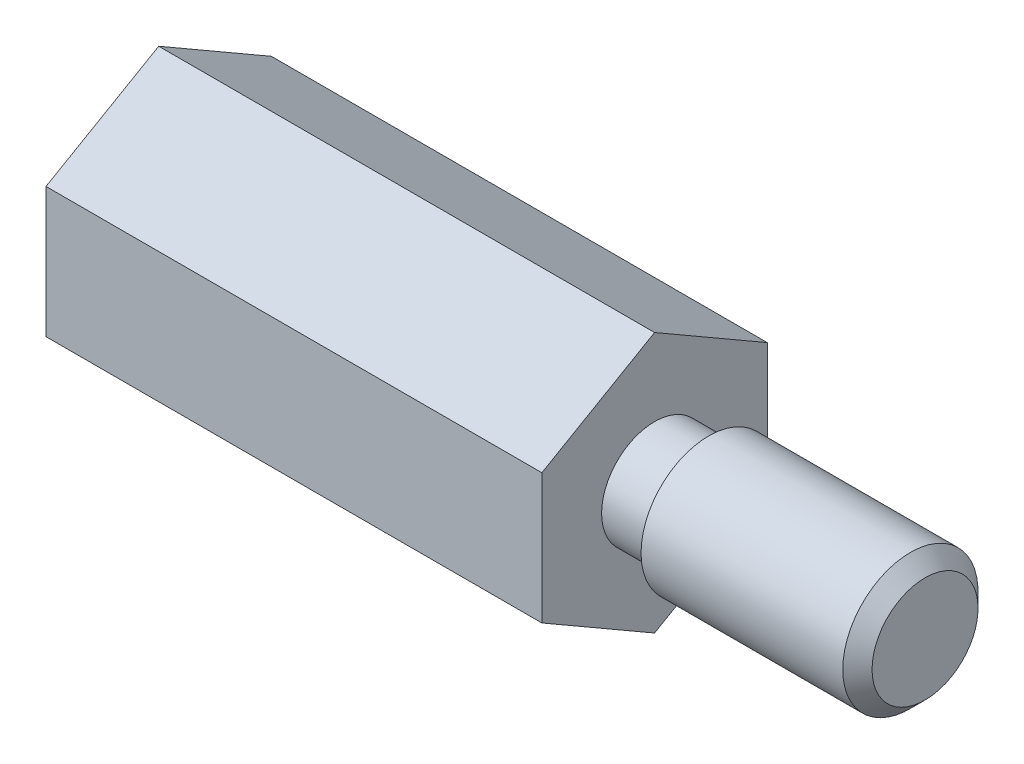
ISO-10303-21;
HEADER;
FILE_DESCRIPTION(('STEP AP214'),'2;1');
FILE_NAME('part.step','',(''),(''),'','','');
FILE_SCHEMA(('AUTOMOTIVE_DESIGN { 1 0 10303 214 1 1 1 1 }'));
ENDSEC;
DATA;
#1=APPLICATION_CONTEXT('core data for automotive mechanical design processes');
#2=APPLICATION_PROTOCOL_DEFINITION('international standard','automotive_design',2000,#1);
#3=PRODUCT_CONTEXT('',#1,'mechanical');
#4=PRODUCT('Part','Part','',(#3));
#5=PRODUCT_RELATED_PRODUCT_CATEGORY('part','',(#4));
#6=PRODUCT_DEFINITION_FORMATION('','',#4);
#7=PRODUCT_DEFINITION_CONTEXT('part definition',#1,'design');
#8=PRODUCT_DEFINITION('design','',#6,#7);
#9=PRODUCT_DEFINITION_SHAPE('','',#8);
#10=(LENGTH_UNIT() NAMED_UNIT(*) SI_UNIT(.MILLI.,.METRE.));
#11=(NAMED_UNIT(*) PLANE_ANGLE_UNIT() SI_UNIT($,.RADIAN.));
#12=(NAMED_UNIT(*) SI_UNIT($,.STERADIAN.) SOLID_ANGLE_UNIT());
#13=UNCERTAINTY_MEASURE_WITH_UNIT(LENGTH_MEASURE(1.E-05),#10,'distance_accuracy_value','');
#14=(GEOMETRIC_REPRESENTATION_CONTEXT(3) GLOBAL_UNCERTAINTY_ASSIGNED_CONTEXT((#13)) GLOBAL_UNIT_ASSIGNED_CONTEXT((#10,
#11,#12)) REPRESENTATION_CONTEXT('',''));
#15=CARTESIAN_POINT('',(0.,0.,0.));
#16=DIRECTION('',(0.,0.,1.));
#17=DIRECTION('',(1.,0.,0.));
#18=AXIS2_PLACEMENT_3D('',#15,#16,#17);
#19=CARTESIAN_POINT('',(11.,-1.44337567297406,-2.5));
#20=DIRECTION('',(0.,-0.866025403784438,-0.5));
#21=DIRECTION('',(0.,0.5,-0.866025403784438));
#22=AXIS2_PLACEMENT_3D('',#19,#20,#21);
#23=PLANE('',#22);
#24=DIRECTION('',(0.,-0.5,0.866025403784438));
#25=VECTOR('',#24,1.);
#26=CARTESIAN_POINT('',(0.,-1.44337567297406,-2.5));
#27=LINE('',#26,#25);
#28=CARTESIAN_POINT('',(0.,-1.44337567297406,-2.5));
#29=VERTEX_POINT('',#28);
#30=CARTESIAN_POINT('',(0.,-2.88675134594813,0.));
#31=VERTEX_POINT('',#30);
#32=EDGE_CURVE('E126',#29,#31,#27,.T.);
#33=ORIENTED_EDGE('',*,*,#32,.F.);
#34=DIRECTION('',(-1.,0.,0.));
#35=VECTOR('',#34,1.);
#36=CARTESIAN_POINT('',(11.,-1.44337567297406,-2.5));
#37=LINE('',#36,#35);
#38=CARTESIAN_POINT('',(11.,-1.44337567297406,-2.5));
#39=VERTEX_POINT('',#38);
#40=EDGE_CURVE('E53',#39,#29,#37,.T.);
#41=ORIENTED_EDGE('',*,*,#40,.F.);
#42=DIRECTION('',(0.,-0.5,0.866025403784438));
#43=VECTOR('',#42,1.);
#44=CARTESIAN_POINT('',(11.,-1.44337567297406,-2.5));
#45=LINE('',#44,#43);
#46=CARTESIAN_POINT('',(11.,-2.88675134594813,0.));
#47=VERTEX_POINT('',#46);
#48=EDGE_CURVE('E142',#39,#47,#45,.T.);
#49=ORIENTED_EDGE('',*,*,#48,.T.);
#50=DIRECTION('',(-1.,0.,0.));
#51=VECTOR('',#50,1.);
#52=CARTESIAN_POINT('',(11.,-2.88675134594813,0.));
#53=LINE('',#52,#51);
#54=EDGE_CURVE('E89',#47,#31,#53,.T.);
#55=ORIENTED_EDGE('',*,*,#54,.T.);
#56=EDGE_LOOP('',(#33,#41,#49,#55));
#57=FACE_BOUND('',#56,.T.);
#58=ADVANCED_FACE('F36',(#57),#23,.T.);
#59=CARTESIAN_POINT('',(11.,1.44337567297406,-2.5));
#60=DIRECTION('',(0.,0.,-1.));
#61=DIRECTION('',(-1.,0.,0.));
#62=AXIS2_PLACEMENT_3D('',#59,#60,#61);
#63=PLANE('',#62);
#64=DIRECTION('',(0.,-1.,0.));
#65=VECTOR('',#64,1.);
#66=CARTESIAN_POINT('',(0.,1.44337567297406,-2.5));
#67=LINE('',#66,#65);
#68=CARTESIAN_POINT('',(0.,1.44337567297406,-2.5));
#69=VERTEX_POINT('',#68);
#70=EDGE_CURVE('E139',#69,#29,#67,.T.);
#71=ORIENTED_EDGE('',*,*,#70,.F.);
#72=DIRECTION('',(-1.,0.,0.));
#73=VECTOR('',#72,1.);
#74=CARTESIAN_POINT('',(11.,1.44337567297406,-2.5));
#75=LINE('',#74,#73);
#76=CARTESIAN_POINT('',(11.,1.44337567297406,-2.5));
#77=VERTEX_POINT('',#76);
#78=EDGE_CURVE('E77',#77,#69,#75,.T.);
#79=ORIENTED_EDGE('',*,*,#78,.F.);
#80=DIRECTION('',(0.,-1.,0.));
#81=VECTOR('',#80,1.);
#82=CARTESIAN_POINT('',(11.,1.44337567297406,-2.5));
#83=LINE('',#82,#81);
#84=EDGE_CURVE('E116',#77,#39,#83,.T.);
#85=ORIENTED_EDGE('',*,*,#84,.T.);
#86=ORIENTED_EDGE('',*,*,#40,.T.);
#87=EDGE_LOOP('',(#71,#79,#85,#86));
#88=FACE_BOUND('',#87,.T.);
#89=ADVANCED_FACE('F170',(#88),#63,.T.);
#90=CARTESIAN_POINT('',(11.,2.88675134594813,0.));
#91=DIRECTION('',(0.,0.866025403784438,-0.500000000000001));
#92=DIRECTION('',(0.,0.500000000000001,0.866025403784438));
#93=AXIS2_PLACEMENT_3D('',#90,#91,#92);
#94=PLANE('',#93);
#95=DIRECTION('',(0.,-0.500000000000001,-0.866025403784438));
#96=VECTOR('',#95,1.);
#97=CARTESIAN_POINT('',(0.,2.88675134594813,0.));
#98=LINE('',#97,#96);
#99=CARTESIAN_POINT('',(0.,2.88675134594813,0.));
#100=VERTEX_POINT('',#99);
#101=EDGE_CURVE('E103',#100,#69,#98,.T.);
#102=ORIENTED_EDGE('',*,*,#101,.F.);
#103=DIRECTION('',(-1.,0.,0.));
#104=VECTOR('',#103,1.);
#105=CARTESIAN_POINT('',(11.,2.88675134594813,0.));
#106=LINE('',#105,#104);
#107=CARTESIAN_POINT('',(11.,2.88675134594813,0.));
#108=VERTEX_POINT('',#107);
#109=EDGE_CURVE('E98',#108,#100,#106,.T.);
#110=ORIENTED_EDGE('',*,*,#109,.F.);
#111=DIRECTION('',(0.,-0.500000000000001,-0.866025403784438));
#112=VECTOR('',#111,1.);
#113=CARTESIAN_POINT('',(11.,2.88675134594813,0.));
#114=LINE('',#113,#112);
#115=EDGE_CURVE('E101',#108,#77,#114,.T.);
#116=ORIENTED_EDGE('',*,*,#115,.T.);
#117=ORIENTED_EDGE('',*,*,#78,.T.);
#118=EDGE_LOOP('',(#102,#110,#116,#117));
#119=FACE_BOUND('',#118,.T.);
#120=ADVANCED_FACE('F100',(#119),#94,.T.);
#121=CARTESIAN_POINT('',(11.,1.44337567297406,2.5));
#122=DIRECTION('',(0.,0.866025403784439,0.5));
#123=DIRECTION('',(0.,-0.5,0.866025403784439));
#124=AXIS2_PLACEMENT_3D('',#121,#122,#123);
#125=PLANE('',#124);
#126=DIRECTION('',(0.,0.5,-0.866025403784438));
#127=VECTOR('',#126,1.);
#128=CARTESIAN_POINT('',(0.,1.44337567297406,2.5));
#129=LINE('',#128,#127);
#130=CARTESIAN_POINT('',(0.,1.44337567297406,2.5));
#131=VERTEX_POINT('',#130);
#132=EDGE_CURVE('E136',#131,#100,#129,.T.);
#133=ORIENTED_EDGE('',*,*,#132,.F.);
#134=DIRECTION('',(-1.,0.,0.));
#135=VECTOR('',#134,1.);
#136=CARTESIAN_POINT('',(11.,1.44337567297406,2.5));
#137=LINE('',#136,#135);
#138=CARTESIAN_POINT('',(11.,1.44337567297406,2.5));
#139=VERTEX_POINT('',#138);
#140=EDGE_CURVE('E108',#139,#131,#137,.T.);
#141=ORIENTED_EDGE('',*,*,#140,.F.);
#142=DIRECTION('',(0.,0.5,-0.866025403784438));
#143=VECTOR('',#142,1.);
#144=CARTESIAN_POINT('',(11.,1.44337567297406,2.5));
#145=LINE('',#144,#143);
#146=EDGE_CURVE('E114',#139,#108,#145,.T.);
#147=ORIENTED_EDGE('',*,*,#146,.T.);
#148=ORIENTED_EDGE('',*,*,#109,.T.);
#149=EDGE_LOOP('',(#133,#141,#147,#148));
#150=FACE_BOUND('',#149,.T.);
#151=ADVANCED_FACE('F118',(#150),#125,.T.);
#152=CARTESIAN_POINT('',(11.,-1.44337567297406,2.5));
#153=DIRECTION('',(0.,0.,1.));
#154=DIRECTION('',(1.,0.,0.));
#155=AXIS2_PLACEMENT_3D('',#152,#153,#154);
#156=PLANE('',#155);
#157=DIRECTION('',(0.,1.,0.));
#158=VECTOR('',#157,1.);
#159=CARTESIAN_POINT('',(0.,-1.44337567297406,2.5));
#160=LINE('',#159,#158);
#161=CARTESIAN_POINT('',(0.,-1.44337567297406,2.5));
#162=VERTEX_POINT('',#161);
#163=EDGE_CURVE('E133',#162,#131,#160,.T.);
#164=ORIENTED_EDGE('',*,*,#163,.F.);
#165=DIRECTION('',(-1.,0.,0.));
#166=VECTOR('',#165,1.);
#167=CARTESIAN_POINT('',(11.,-1.44337567297406,2.5));
#168=LINE('',#167,#166);
#169=CARTESIAN_POINT('',(11.,-1.44337567297406,2.5));
#170=VERTEX_POINT('',#169);
#171=EDGE_CURVE('E147',#170,#162,#168,.T.);
#172=ORIENTED_EDGE('',*,*,#171,.F.);
#173=DIRECTION('',(0.,1.,0.));
#174=VECTOR('',#173,1.);
#175=CARTESIAN_POINT('',(11.,-1.44337567297406,2.5));
#176=LINE('',#175,#174);
#177=EDGE_CURVE('E119',#170,#139,#176,.T.);
#178=ORIENTED_EDGE('',*,*,#177,.T.);
#179=ORIENTED_EDGE('',*,*,#140,.T.);
#180=EDGE_LOOP('',(#164,#172,#178,#179));
#181=FACE_BOUND('',#180,.T.);
#182=ADVANCED_FACE('F180',(#181),#156,.T.);
#183=CARTESIAN_POINT('',(11.,-2.88675134594813,0.));
#184=DIRECTION('',(0.,-0.866025403784438,0.500000000000001));
#185=DIRECTION('',(0.,-0.500000000000001,-0.866025403784438));
#186=AXIS2_PLACEMENT_3D('',#183,#184,#185);
#187=PLANE('',#186);
#188=DIRECTION('',(0.,0.500000000000001,0.866025403784438));
#189=VECTOR('',#188,1.);
#190=CARTESIAN_POINT('',(0.,-2.88675134594813,0.));
#191=LINE('',#190,#189);
#192=EDGE_CURVE('E129',#31,#162,#191,.T.);
#193=ORIENTED_EDGE('',*,*,#192,.F.);
#194=ORIENTED_EDGE('',*,*,#54,.F.);
#195=DIRECTION('',(0.,0.500000000000001,0.866025403784438));
#196=VECTOR('',#195,1.);
#197=CARTESIAN_POINT('',(11.,-2.88675134594813,0.));
#198=LINE('',#197,#196);
#199=EDGE_CURVE('E121',#47,#170,#198,.T.);
#200=ORIENTED_EDGE('',*,*,#199,.T.);
#201=ORIENTED_EDGE('',*,*,#171,.T.);
#202=EDGE_LOOP('',(#193,#194,#200,#201));
#203=FACE_BOUND('',#202,.T.);
#204=ADVANCED_FACE('F177',(#203),#187,.T.);
#205=CARTESIAN_POINT('',(11.,0.,0.));
#206=DIRECTION('',(-1.,0.,0.));
#207=DIRECTION('',(0.,0.,1.));
#208=AXIS2_PLACEMENT_3D('',#205,#206,#207);
#209=PLANE('',#208);
#210=CARTESIAN_POINT('',(11.,0.,0.));
#211=DIRECTION('',(-1.,0.,0.));
#212=DIRECTION('',(0.,0.,1.));
#213=AXIS2_PLACEMENT_3D('',#210,#211,#212);
#214=CIRCLE('',#213,1.175);
#215=CARTESIAN_POINT('',(11.,0.,1.175));
#216=VERTEX_POINT('',#215);
#217=EDGE_CURVE('E236',#216,#216,#214,.T.);
#218=ORIENTED_EDGE('',*,*,#217,.T.);
#219=EDGE_LOOP('',(#218));
#220=FACE_BOUND('',#219,.T.);
#221=ORIENTED_EDGE('',*,*,#48,.F.);
#222=ORIENTED_EDGE('',*,*,#84,.F.);
#223=ORIENTED_EDGE('',*,*,#115,.F.);
#224=ORIENTED_EDGE('',*,*,#146,.F.);
#225=ORIENTED_EDGE('',*,*,#177,.F.);
#226=ORIENTED_EDGE('',*,*,#199,.F.);
#227=EDGE_LOOP('',(#221,#222,#223,#224,#225,#226));
#228=FACE_BOUND('',#227,.T.);
#229=ADVANCED_FACE('F112',(#220,#228),#209,.F.);
#230=CARTESIAN_POINT('',(0.,0.,0.));
#231=DIRECTION('',(-1.,0.,0.));
#232=DIRECTION('',(0.,0.,1.));
#233=AXIS2_PLACEMENT_3D('',#230,#231,#232);
#234=PLANE('',#233);
#235=CARTESIAN_POINT('',(0.,0.,0.));
#236=DIRECTION('',(-1.,0.,0.));
#237=DIRECTION('',(0.,0.,1.));
#238=AXIS2_PLACEMENT_3D('',#235,#236,#237);
#239=CIRCLE('',#238,1.554375);
#240=CARTESIAN_POINT('',(0.,0.,1.554375));
#241=VERTEX_POINT('',#240);
#242=EDGE_CURVE('E144',#241,#241,#239,.F.);
#243=ORIENTED_EDGE('',*,*,#242,.T.);
#244=EDGE_LOOP('',(#243));
#245=FACE_BOUND('',#244,.T.);
#246=ORIENTED_EDGE('',*,*,#32,.T.);
#247=ORIENTED_EDGE('',*,*,#192,.T.);
#248=ORIENTED_EDGE('',*,*,#163,.T.);
#249=ORIENTED_EDGE('',*,*,#132,.T.);
#250=ORIENTED_EDGE('',*,*,#101,.T.);
#251=ORIENTED_EDGE('',*,*,#70,.T.);
#252=EDGE_LOOP('',(#246,#247,#248,#249,#250,#251));
#253=FACE_BOUND('',#252,.T.);
#254=ADVANCED_FACE('F188',(#245,#253),#234,.T.);
#255=CARTESIAN_POINT('',(0.,0.,0.));
#256=DIRECTION('',(1.,0.,0.));
#257=DIRECTION('',(0.,0.,-1.));
#258=AXIS2_PLACEMENT_3D('',#255,#256,#257);
#259=CYLINDRICAL_SURFACE('',#258,1.229375);
#260=CARTESIAN_POINT('',(0.325000000000004,0.,0.));
#261=DIRECTION('',(-1.,0.,0.));
#262=DIRECTION('',(0.,0.,1.));
#263=AXIS2_PLACEMENT_3D('',#260,#261,#262);
#264=CIRCLE('',#263,1.229375);
#265=CARTESIAN_POINT('',(0.325000000000004,0.,1.229375));
#266=VERTEX_POINT('',#265);
#267=EDGE_CURVE('E152',#266,#266,#264,.T.);
#268=ORIENTED_EDGE('',*,*,#267,.T.);
#269=EDGE_LOOP('',(#268));
#270=FACE_BOUND('',#269,.T.);
#271=CARTESIAN_POINT('',(8.,0.,0.));
#272=DIRECTION('',(1.,0.,0.));
#273=DIRECTION('',(0.,0.,-1.));
#274=AXIS2_PLACEMENT_3D('',#271,#272,#273);
#275=CIRCLE('',#274,1.229375);
#276=CARTESIAN_POINT('',(8.,0.,-1.229375));
#277=VERTEX_POINT('',#276);
#278=EDGE_CURVE('E239',#277,#277,#275,.T.);
#279=ORIENTED_EDGE('',*,*,#278,.T.);
#280=EDGE_LOOP('',(#279));
#281=FACE_BOUND('',#280,.T.);
#282=ADVANCED_FACE('F191',(#270,#281),#259,.F.);
#283=CARTESIAN_POINT('',(9.999979987185,0.,0.));
#284=DIRECTION('',(-1.,0.,0.));
#285=DIRECTION('',(0.,0.,1.));
#286=AXIS2_PLACEMENT_3D('',#283,#284,#285);
#287=CONICAL_SURFACE('',#286,0.,1.04719755119659);
#288=CARTESIAN_POINT('',(9.2902,0.,0.));
#289=DIRECTION('',(1.,0.,0.));
#290=DIRECTION('',(0.,0.,-1.));
#291=AXIS2_PLACEMENT_3D('',#288,#289,#290);
#292=CIRCLE('',#291,1.229375);
#293=CARTESIAN_POINT('',(9.2902,0.,-1.229375));
#294=VERTEX_POINT('',#293);
#295=EDGE_CURVE('E130',#294,#294,#292,.T.);
#296=ORIENTED_EDGE('',*,*,#295,.F.);
#297=EDGE_LOOP('',(#296));
#298=FACE_BOUND('',#297,.T.);
#299=CARTESIAN_POINT('',(9.999979987185,0.,0.));
#300=VERTEX_POINT('',#299);
#301=VERTEX_LOOP('',#300);
#302=FACE_BOUND('',#301,.T.);
#303=ADVANCED_FACE('F198',(#298,#302),#287,.F.);
#304=CARTESIAN_POINT('',(0.,0.,0.));
#305=DIRECTION('',(1.,0.,0.));
#306=DIRECTION('',(0.,0.,-1.));
#307=AXIS2_PLACEMENT_3D('',#304,#305,#306);
#308=CYLINDRICAL_SURFACE('',#307,1.229375);
#309=CARTESIAN_POINT('',(8.270625,0.,0.));
#310=DIRECTION('',(1.,0.,0.));
#311=DIRECTION('',(0.,0.,-1.));
#312=AXIS2_PLACEMENT_3D('',#309,#310,#311);
#313=CIRCLE('',#312,1.229375);
#314=CARTESIAN_POINT('',(8.270625,0.,-1.229375));
#315=VERTEX_POINT('',#314);
#316=EDGE_CURVE('E248',#315,#315,#313,.T.);
#317=ORIENTED_EDGE('',*,*,#316,.F.);
#318=EDGE_LOOP('',(#317));
#319=FACE_BOUND('',#318,.T.);
#320=ORIENTED_EDGE('',*,*,#295,.T.);
#321=EDGE_LOOP('',(#320));
#322=FACE_BOUND('',#321,.T.);
#323=ADVANCED_FACE('F202',(#319,#322),#308,.F.);
#324=CARTESIAN_POINT('',(8.270625,0.,0.));
#325=DIRECTION('',(-1.,0.,0.));
#326=DIRECTION('',(0.,0.,1.));
#327=AXIS2_PLACEMENT_3D('',#324,#325,#326);
#328=CONICAL_SURFACE('',#327,1.229375,0.785398163397448);
#329=CARTESIAN_POINT('',(8.,0.,0.));
#330=DIRECTION('',(1.,0.,0.));
#331=DIRECTION('',(0.,0.,-1.));
#332=AXIS2_PLACEMENT_3D('',#329,#330,#331);
#333=CIRCLE('',#332,1.5);
#334=CARTESIAN_POINT('',(8.,0.,-1.5));
#335=VERTEX_POINT('',#334);
#336=EDGE_CURVE('E245',#335,#335,#333,.T.);
#337=ORIENTED_EDGE('',*,*,#336,.F.);
#338=EDGE_LOOP('',(#337));
#339=FACE_BOUND('',#338,.T.);
#340=ORIENTED_EDGE('',*,*,#316,.T.);
#341=EDGE_LOOP('',(#340));
#342=FACE_BOUND('',#341,.T.);
#343=ADVANCED_FACE('F206',(#339,#342),#328,.F.);
#344=CARTESIAN_POINT('',(8.,1.5,0.));
#345=DIRECTION('',(-1.,0.,0.));
#346=DIRECTION('',(0.,0.,1.));
#347=AXIS2_PLACEMENT_3D('',#344,#345,#346);
#348=PLANE('',#347);
#349=ORIENTED_EDGE('',*,*,#278,.F.);
#350=EDGE_LOOP('',(#349));
#351=FACE_BOUND('',#350,.T.);
#352=ORIENTED_EDGE('',*,*,#336,.T.);
#353=EDGE_LOOP('',(#352));
#354=FACE_BOUND('',#353,.T.);
#355=ADVANCED_FACE('F210',(#351,#354),#348,.F.);
#356=CARTESIAN_POINT('',(17.,0.,0.));
#357=DIRECTION('',(-1.,0.,0.));
#358=DIRECTION('',(0.,0.,1.));
#359=AXIS2_PLACEMENT_3D('',#356,#357,#358);
#360=CYLINDRICAL_SURFACE('',#359,1.5);
#361=CARTESIAN_POINT('',(16.675,0.,0.));
#362=DIRECTION('',(1.,0.,0.));
#363=DIRECTION('',(0.,0.,-1.));
#364=AXIS2_PLACEMENT_3D('',#361,#362,#363);
#365=CIRCLE('',#364,1.5);
#366=CARTESIAN_POINT('',(16.675,0.,1.5));
#367=VERTEX_POINT('',#366);
#368=EDGE_CURVE('E45',#367,#367,#365,.F.);
#369=ORIENTED_EDGE('',*,*,#368,.T.);
#370=EDGE_LOOP('',(#369));
#371=FACE_BOUND('',#370,.T.);
#372=CARTESIAN_POINT('',(12.2,0.,0.));
#373=DIRECTION('',(-1.,0.,0.));
#374=DIRECTION('',(0.,0.,1.));
#375=AXIS2_PLACEMENT_3D('',#372,#373,#374);
#376=CIRCLE('',#375,1.5);
#377=CARTESIAN_POINT('',(12.2,0.,1.5));
#378=VERTEX_POINT('',#377);
#379=EDGE_CURVE('E232',#378,#378,#376,.T.);
#380=ORIENTED_EDGE('',*,*,#379,.F.);
#381=EDGE_LOOP('',(#380));
#382=FACE_BOUND('',#381,.T.);
#383=ADVANCED_FACE('F157',(#371,#382),#360,.T.);
#384=CARTESIAN_POINT('',(17.,1.5,0.));
#385=DIRECTION('',(1.,0.,0.));
#386=DIRECTION('',(0.,0.,-1.));
#387=AXIS2_PLACEMENT_3D('',#384,#385,#386);
#388=PLANE('',#387);
#389=CARTESIAN_POINT('',(17.,0.,0.));
#390=DIRECTION('',(1.,0.,0.));
#391=DIRECTION('',(0.,0.,-1.));
#392=AXIS2_PLACEMENT_3D('',#389,#390,#391);
#393=CIRCLE('',#392,1.175);
#394=CARTESIAN_POINT('',(17.,0.,1.175));
#395=VERTEX_POINT('',#394);
#396=EDGE_CURVE('E11',#395,#395,#393,.T.);
#397=ORIENTED_EDGE('',*,*,#396,.T.);
#398=EDGE_LOOP('',(#397));
#399=FACE_BOUND('',#398,.T.);
#400=ADVANCED_FACE('F217',(#399),#388,.T.);
#401=CARTESIAN_POINT('',(17.,0.,0.));
#402=DIRECTION('',(-1.,0.,0.));
#403=DIRECTION('',(0.,0.,1.));
#404=AXIS2_PLACEMENT_3D('',#401,#402,#403);
#405=CYLINDRICAL_SURFACE('',#404,1.175);
#406=CARTESIAN_POINT('',(12.2,0.,0.));
#407=DIRECTION('',(-1.,0.,0.));
#408=DIRECTION('',(0.,0.,1.));
#409=AXIS2_PLACEMENT_3D('',#406,#407,#408);
#410=CIRCLE('',#409,1.175);
#411=CARTESIAN_POINT('',(12.2,0.,1.175));
#412=VERTEX_POINT('',#411);
#413=EDGE_CURVE('E235',#412,#412,#410,.T.);
#414=ORIENTED_EDGE('',*,*,#413,.T.);
#415=EDGE_LOOP('',(#414));
#416=FACE_BOUND('',#415,.T.);
#417=ORIENTED_EDGE('',*,*,#217,.F.);
#418=EDGE_LOOP('',(#417));
#419=FACE_BOUND('',#418,.T.);
#420=ADVANCED_FACE('F220',(#416,#419),#405,.T.);
#421=CARTESIAN_POINT('',(12.2,1.175,0.));
#422=DIRECTION('',(-1.,0.,0.));
#423=DIRECTION('',(0.,0.,1.));
#424=AXIS2_PLACEMENT_3D('',#421,#422,#423);
#425=PLANE('',#424);
#426=ORIENTED_EDGE('',*,*,#379,.T.);
#427=EDGE_LOOP('',(#426));
#428=FACE_BOUND('',#427,.T.);
#429=ORIENTED_EDGE('',*,*,#413,.F.);
#430=EDGE_LOOP('',(#429));
#431=FACE_BOUND('',#430,.T.);
#432=ADVANCED_FACE('F166',(#428,#431),#425,.T.);
#433=CARTESIAN_POINT('',(0.,0.,0.));
#434=DIRECTION('',(-1.,0.,0.));
#435=DIRECTION('',(0.,0.,1.));
#436=AXIS2_PLACEMENT_3D('',#433,#434,#435);
#437=CONICAL_SURFACE('',#436,1.554375,0.785398163397442);
#438=ORIENTED_EDGE('',*,*,#267,.F.);
#439=EDGE_LOOP('',(#438));
#440=FACE_BOUND('',#439,.T.);
#441=ORIENTED_EDGE('',*,*,#242,.F.);
#442=EDGE_LOOP('',(#441));
#443=FACE_BOUND('',#442,.T.);
#444=ADVANCED_FACE('F161',(#440,#443),#437,.F.);
#445=CARTESIAN_POINT('',(16.675,0.,0.));
#446=DIRECTION('',(-1.,0.,0.));
#447=DIRECTION('',(0.,0.,1.));
#448=AXIS2_PLACEMENT_3D('',#445,#446,#447);
#449=CONICAL_SURFACE('',#448,1.5,0.785398163397449);
#450=CARTESIAN_POINT('',(17.,0.,1.175));
#451=CARTESIAN_POINT('',(16.9966145833333,0.,1.17838541666667));
#452=CARTESIAN_POINT('',(16.9932291666667,0.,1.18177083333334));
#453=CARTESIAN_POINT('',(16.9864583333333,0.,1.18854166666667));
#454=CARTESIAN_POINT('',(16.9830729166667,0.,1.19192708333334));
#455=CARTESIAN_POINT('',(16.9763020833333,0.,1.19869791666667));
#456=CARTESIAN_POINT('',(16.9729166666667,0.,1.20208333333334));
#457=CARTESIAN_POINT('',(16.9661458333333,0.,1.20885416666667));
#458=CARTESIAN_POINT('',(16.9627604166667,0.,1.21223958333334));
#459=CARTESIAN_POINT('',(16.9559895833333,0.,1.21901041666667));
#460=CARTESIAN_POINT('',(16.9526041666667,0.,1.22239583333334));
#461=CARTESIAN_POINT('',(16.9458333333333,0.,1.22916666666667));
#462=CARTESIAN_POINT('',(16.9424479166667,0.,1.23255208333334));
#463=CARTESIAN_POINT('',(16.9356770833333,0.,1.23932291666667));
#464=CARTESIAN_POINT('',(16.9322916666667,0.,1.24270833333334));
#465=CARTESIAN_POINT('',(16.9255208333333,0.,1.24947916666667));
#466=CARTESIAN_POINT('',(16.9221354166667,0.,1.25286458333334));
#467=CARTESIAN_POINT('',(16.9153645833333,0.,1.25963541666667));
#468=CARTESIAN_POINT('',(16.9119791666667,0.,1.26302083333334));
#469=CARTESIAN_POINT('',(16.9052083333333,0.,1.26979166666667));
#470=CARTESIAN_POINT('',(16.9018229166667,0.,1.27317708333334));
#471=CARTESIAN_POINT('',(16.8950520833333,0.,1.27994791666667));
#472=CARTESIAN_POINT('',(16.8916666666667,0.,1.28333333333334));
#473=CARTESIAN_POINT('',(16.8848958333333,0.,1.29010416666667));
#474=CARTESIAN_POINT('',(16.8815104166667,0.,1.29348958333334));
#475=CARTESIAN_POINT('',(16.8747395833333,0.,1.30026041666667));
#476=CARTESIAN_POINT('',(16.8713541666667,0.,1.30364583333334));
#477=CARTESIAN_POINT('',(16.8645833333333,0.,1.31041666666667));
#478=CARTESIAN_POINT('',(16.8611979166667,0.,1.31380208333334));
#479=CARTESIAN_POINT('',(16.8544270833333,0.,1.32057291666667));
#480=CARTESIAN_POINT('',(16.8510416666667,0.,1.32395833333334));
#481=CARTESIAN_POINT('',(16.8442708333333,0.,1.33072916666667));
#482=CARTESIAN_POINT('',(16.8408854166667,0.,1.33411458333334));
#483=CARTESIAN_POINT('',(16.8341145833333,0.,1.34088541666667));
#484=CARTESIAN_POINT('',(16.8307291666667,0.,1.34427083333334));
#485=CARTESIAN_POINT('',(16.8239583333333,0.,1.35104166666667));
#486=CARTESIAN_POINT('',(16.8205729166667,0.,1.35442708333334));
#487=CARTESIAN_POINT('',(16.8138020833333,0.,1.36119791666667));
#488=CARTESIAN_POINT('',(16.8104166666667,0.,1.36458333333334));
#489=CARTESIAN_POINT('',(16.8036458333333,0.,1.37135416666667));
#490=CARTESIAN_POINT('',(16.8002604166667,0.,1.37473958333334));
#491=CARTESIAN_POINT('',(16.7934895833333,0.,1.38151041666667));
#492=CARTESIAN_POINT('',(16.7901041666667,0.,1.38489583333333));
#493=CARTESIAN_POINT('',(16.7833333333333,0.,1.39166666666667));
#494=CARTESIAN_POINT('',(16.7799479166667,0.,1.39505208333334));
#495=CARTESIAN_POINT('',(16.7731770833333,0.,1.40182291666667));
#496=CARTESIAN_POINT('',(16.7697916666667,0.,1.40520833333334));
#497=CARTESIAN_POINT('',(16.7630208333333,0.,1.41197916666667));
#498=CARTESIAN_POINT('',(16.7596354166667,0.,1.41536458333334));
#499=CARTESIAN_POINT('',(16.7528645833333,0.,1.42213541666667));
#500=CARTESIAN_POINT('',(16.7494791666667,0.,1.42552083333334));
#501=CARTESIAN_POINT('',(16.7427083333333,0.,1.43229166666667));
#502=CARTESIAN_POINT('',(16.7393229166667,0.,1.43567708333333));
#503=CARTESIAN_POINT('',(16.7325520833333,0.,1.44244791666667));
#504=CARTESIAN_POINT('',(16.7291666666667,0.,1.44583333333334));
#505=CARTESIAN_POINT('',(16.7223958333333,0.,1.45260416666667));
#506=CARTESIAN_POINT('',(16.7190104166667,0.,1.45598958333334));
#507=CARTESIAN_POINT('',(16.7122395833333,0.,1.46276041666667));
#508=CARTESIAN_POINT('',(16.7088541666667,0.,1.46614583333334));
#509=CARTESIAN_POINT('',(16.7020833333333,0.,1.47291666666667));
#510=CARTESIAN_POINT('',(16.6986979166667,0.,1.47630208333334));
#511=CARTESIAN_POINT('',(16.6919270833333,0.,1.48307291666667));
#512=CARTESIAN_POINT('',(16.6885416666667,0.,1.48645833333333));
#513=CARTESIAN_POINT('',(16.6817708333333,0.,1.49322916666667));
#514=CARTESIAN_POINT('',(16.6783854166667,0.,1.49661458333333));
#515=CARTESIAN_POINT('',(16.675,0.,1.5));
#516=B_SPLINE_CURVE_WITH_KNOTS('',3,(#450,#451,#452,#453,#454,#455,#456,#457,#458,#459,#460,
#461,#462,#463,#464,#465,#466,#467,#468,#469,#470,#471,#472,#473,#474,#475,#476,#477,#478,#479,
#480,#481,#482,#483,#484,#485,#486,#487,#488,#489,#490,#491,#492,#493,#494,#495,#496,#497,#498,
#499,#500,#501,#502,#503,#504,#505,#506,#507,#508,#509,#510,#511,#512,#513,#514,#515),
.UNSPECIFIED.,.F.,.F.,(4,2,2,2,2,2,2,2,2,2,2,2,2,2,2,2,2,2,2,2,2,2,2,2,2,2,2,2,2,2,2,2,4),(0.,
0.0143631064928497,0.0287262129857019,0.043089319478554,0.0574524259714062,0.0718155324642583,
0.086178638957108,0.10054174544996,0.114904851942812,0.129267958435665,0.143631064928517,
0.157994171421367,0.172357277914219,0.186720384407071,0.201083490899923,0.215446597392775,
0.229809703885627,0.244172810378477,0.258535916871329,0.272899023364181,0.287262129857034,
0.301625236349886,0.315988342842735,0.330351449335588,0.34471455582844,0.359077662321292,
0.373440768814144,0.387803875306994,0.402166981799846,0.416530088292698,0.43089319478555,
0.445256301278403,0.459619407771252),.UNSPECIFIED.);
#517=EDGE_CURVE('BSEAM38',#395,#367,#516,.T.);
#518=ORIENTED_EDGE('',*,*,#396,.F.);
#519=ORIENTED_EDGE('',*,*,#368,.F.);
#520=ORIENTED_EDGE('',*,*,#517,.T.);
#521=ORIENTED_EDGE('',*,*,#517,.F.);
#522=EDGE_LOOP('',(#518,#520,#519,#521));
#523=FACE_BOUND('',#522,.T.);
#524=ADVANCED_FACE('F38',(#523),#449,.T.);
#525=CLOSED_SHELL('',(#58,#89,#120,#151,#182,#204,#229,#254,#282,#303,#323,#343,#355,#383,#400,
#420,#432,#444,#524));
#526=MANIFOLD_SOLID_BREP('B2',#525);
#527=ADVANCED_BREP_SHAPE_REPRESENTATION('',(#18,#526),#14);
#528=SHAPE_DEFINITION_REPRESENTATION(#9,#527);
ENDSEC;
END-ISO-10303-21;
